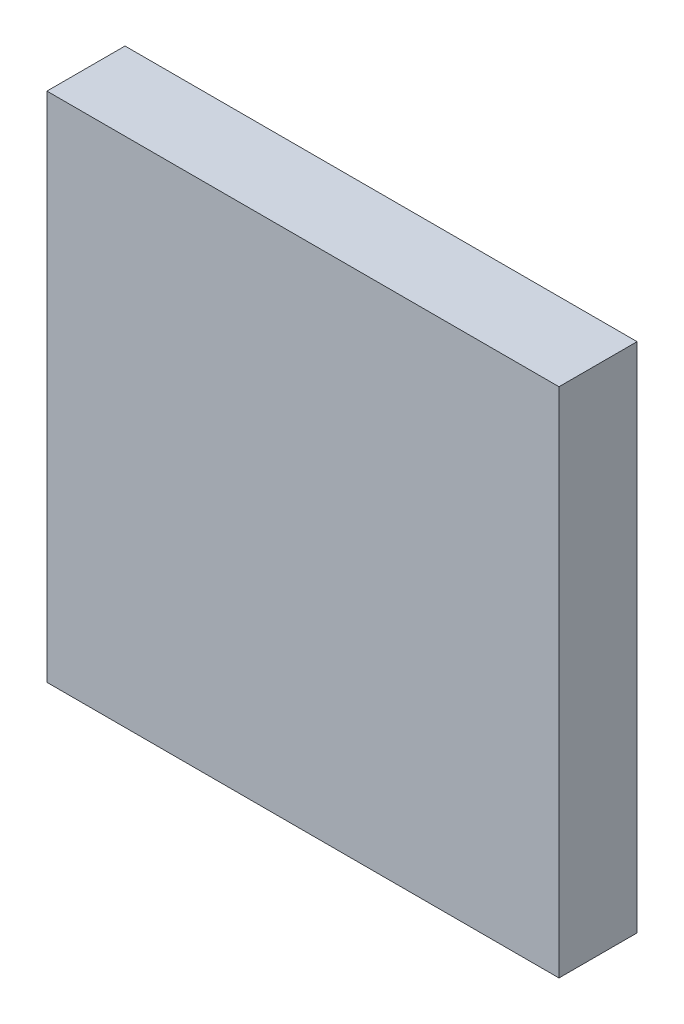
ISO-10303-21;
HEADER;
FILE_DESCRIPTION(('STEP AP214'),'2;1');
FILE_NAME('part.step','',(''),(''),'','','');
FILE_SCHEMA(('AUTOMOTIVE_DESIGN { 1 0 10303 214 1 1 1 1 }'));
ENDSEC;
DATA;
#1=APPLICATION_CONTEXT('core data for automotive mechanical design processes');
#2=APPLICATION_PROTOCOL_DEFINITION('international standard','automotive_design',2000,#1);
#3=PRODUCT_CONTEXT('',#1,'mechanical');
#4=PRODUCT('Part','Part','',(#3));
#5=PRODUCT_RELATED_PRODUCT_CATEGORY('part','',(#4));
#6=PRODUCT_DEFINITION_FORMATION('','',#4);
#7=PRODUCT_DEFINITION_CONTEXT('part definition',#1,'design');
#8=PRODUCT_DEFINITION('design','',#6,#7);
#9=PRODUCT_DEFINITION_SHAPE('','',#8);
#10=(LENGTH_UNIT() NAMED_UNIT(*) SI_UNIT(.MILLI.,.METRE.));
#11=(NAMED_UNIT(*) PLANE_ANGLE_UNIT() SI_UNIT($,.RADIAN.));
#12=(NAMED_UNIT(*) SI_UNIT($,.STERADIAN.) SOLID_ANGLE_UNIT());
#13=UNCERTAINTY_MEASURE_WITH_UNIT(LENGTH_MEASURE(1.E-05),#10,'distance_accuracy_value','');
#14=(GEOMETRIC_REPRESENTATION_CONTEXT(3) GLOBAL_UNCERTAINTY_ASSIGNED_CONTEXT((#13)) GLOBAL_UNIT_ASSIGNED_CONTEXT((#10,
#11,#12)) REPRESENTATION_CONTEXT('',''));
#15=CARTESIAN_POINT('',(0.,0.,0.));
#16=DIRECTION('',(0.,0.,1.));
#17=DIRECTION('',(1.,0.,0.));
#18=AXIS2_PLACEMENT_3D('',#15,#16,#17);
#19=CARTESIAN_POINT('',(150.815,-149.315,0.));
#20=DIRECTION('',(0.,-1.,0.));
#21=DIRECTION('',(1.,0.,0.));
#22=AXIS2_PLACEMENT_3D('',#19,#20,#21);
#23=PLANE('',#22);
#24=DIRECTION('',(0.,0.,1.));
#25=VECTOR('',#24,1.);
#26=CARTESIAN_POINT('',(72.6789610306779,-149.315,0.));
#27=LINE('',#26,#25);
#28=CARTESIAN_POINT('',(72.6789610306779,-149.315,3.5));
#29=VERTEX_POINT('',#28);
#30=CARTESIAN_POINT('',(72.6789610306779,-149.315,44.5));
#31=VERTEX_POINT('',#30);
#32=EDGE_CURVE('E184',#29,#31,#27,.T.);
#33=ORIENTED_EDGE('',*,*,#32,.F.);
#34=DIRECTION('',(-1.,0.,0.));
#35=VECTOR('',#34,1.);
#36=CARTESIAN_POINT('',(150.815,-149.315,3.5));
#37=LINE('',#36,#35);
#38=CARTESIAN_POINT('',(72.6078932188125,-149.315,3.5));
#39=VERTEX_POINT('',#38);
#40=EDGE_CURVE('E258',#29,#39,#37,.T.);
#41=ORIENTED_EDGE('',*,*,#40,.T.);
#42=DIRECTION('',(0.,0.,1.));
#43=VECTOR('',#42,1.);
#44=CARTESIAN_POINT('',(72.6078932188125,-149.315,0.));
#45=LINE('',#44,#43);
#46=CARTESIAN_POINT('',(72.6078932188125,-149.315,0.));
#47=VERTEX_POINT('',#46);
#48=EDGE_CURVE('E323',#47,#39,#45,.T.);
#49=ORIENTED_EDGE('',*,*,#48,.F.);
#50=DIRECTION('',(1.,0.,0.));
#51=VECTOR('',#50,1.);
#52=CARTESIAN_POINT('',(150.815,-149.315,0.));
#53=LINE('',#52,#51);
#54=CARTESIAN_POINT('',(-149.315,-149.315,0.));
#55=VERTEX_POINT('',#54);
#56=EDGE_CURVE('E313',#55,#47,#53,.T.);
#57=ORIENTED_EDGE('',*,*,#56,.F.);
#58=DIRECTION('',(0.,0.,1.));
#59=VECTOR('',#58,1.);
#60=CARTESIAN_POINT('',(-149.315,-149.315,0.));
#61=LINE('',#60,#59);
#62=CARTESIAN_POINT('',(-149.315,-149.315,44.5));
#63=VERTEX_POINT('',#62);
#64=EDGE_CURVE('E303',#55,#63,#61,.T.);
#65=ORIENTED_EDGE('',*,*,#64,.T.);
#66=DIRECTION('',(-1.,0.,0.));
#67=VECTOR('',#66,1.);
#68=CARTESIAN_POINT('',(0.,-149.315,44.5));
#69=LINE('',#68,#67);
#70=EDGE_CURVE('E297',#31,#63,#69,.T.);
#71=ORIENTED_EDGE('',*,*,#70,.F.);
#72=EDGE_LOOP('',(#33,#41,#49,#57,#65,#71));
#73=FACE_BOUND('',#72,.T.);
#74=ADVANCED_FACE('F42',(#73),#23,.F.);
#75=DIRECTION('',(0.,0.,-1.));
#76=VECTOR('',#75,1.);
#77=CARTESIAN_POINT('',(76.0378952120001,-149.315,53.4153545558223));
#78=LINE('',#77,#76);
#79=CARTESIAN_POINT('',(76.0378952120001,-149.315,44.5));
#80=VERTEX_POINT('',#79);
#81=CARTESIAN_POINT('',(76.0378952120001,-149.315,3.5));
#82=VERTEX_POINT('',#81);
#83=EDGE_CURVE('E57',#80,#82,#78,.T.);
#84=ORIENTED_EDGE('',*,*,#83,.F.);
#85=CARTESIAN_POINT('',(149.315,-149.315,44.5));
#86=VERTEX_POINT('',#85);
#87=EDGE_CURVE('E301',#86,#80,#69,.T.);
#88=ORIENTED_EDGE('',*,*,#87,.F.);
#89=DIRECTION('',(0.,0.,1.));
#90=VECTOR('',#89,1.);
#91=CARTESIAN_POINT('',(149.315,-149.315,0.));
#92=LINE('',#91,#90);
#93=CARTESIAN_POINT('',(149.315,-149.315,0.));
#94=VERTEX_POINT('',#93);
#95=EDGE_CURVE('E286',#94,#86,#92,.T.);
#96=ORIENTED_EDGE('',*,*,#95,.F.);
#97=CARTESIAN_POINT('',(142.017106781187,-149.315,0.));
#98=VERTEX_POINT('',#97);
#99=EDGE_CURVE('E306',#98,#94,#53,.T.);
#100=ORIENTED_EDGE('',*,*,#99,.F.);
#101=DIRECTION('',(0.,0.,-1.));
#102=VECTOR('',#101,1.);
#103=CARTESIAN_POINT('',(142.017106781187,-149.315,0.));
#104=LINE('',#103,#102);
#105=CARTESIAN_POINT('',(142.017106781187,-149.315,3.5));
#106=VERTEX_POINT('',#105);
#107=EDGE_CURVE('E321',#106,#98,#104,.T.);
#108=ORIENTED_EDGE('',*,*,#107,.F.);
#109=EDGE_CURVE('E318',#106,#82,#37,.T.);
#110=ORIENTED_EDGE('',*,*,#109,.T.);
#111=EDGE_LOOP('',(#84,#88,#96,#100,#108,#110));
#112=FACE_BOUND('',#111,.T.);
#113=ADVANCED_FACE('F356',(#112),#23,.F.);
#114=CARTESIAN_POINT('',(-150.815,-150.815,0.));
#115=DIRECTION('',(0.,0.,-1.));
#116=DIRECTION('',(0.,-1.,0.));
#117=AXIS2_PLACEMENT_3D('',#114,#115,#116);
#118=PLANE('',#117);
#119=DIRECTION('',(0.,-1.,0.));
#120=VECTOR('',#119,1.);
#121=CARTESIAN_POINT('',(-150.815,-150.815,0.));
#122=LINE('',#121,#120);
#123=CARTESIAN_POINT('',(-150.815,150.815,0.));
#124=VERTEX_POINT('',#123);
#125=CARTESIAN_POINT('',(-150.815,-150.815,0.));
#126=VERTEX_POINT('',#125);
#127=EDGE_CURVE('E269',#124,#126,#122,.T.);
#128=ORIENTED_EDGE('',*,*,#127,.F.);
#129=DIRECTION('',(-1.,0.,0.));
#130=VECTOR('',#129,1.);
#131=CARTESIAN_POINT('',(150.815,150.815,0.));
#132=LINE('',#131,#130);
#133=CARTESIAN_POINT('',(150.815,150.815,0.));
#134=VERTEX_POINT('',#133);
#135=EDGE_CURVE('E259',#134,#124,#132,.T.);
#136=ORIENTED_EDGE('',*,*,#135,.F.);
#137=DIRECTION('',(0.,1.,0.));
#138=VECTOR('',#137,1.);
#139=CARTESIAN_POINT('',(150.815,-150.815,0.));
#140=LINE('',#139,#138);
#141=CARTESIAN_POINT('',(150.815,-150.815,0.));
#142=VERTEX_POINT('',#141);
#143=EDGE_CURVE('E263',#142,#134,#140,.T.);
#144=ORIENTED_EDGE('',*,*,#143,.F.);
#145=DIRECTION('',(1.,0.,0.));
#146=VECTOR('',#145,1.);
#147=CARTESIAN_POINT('',(150.815,-150.815,0.));
#148=LINE('',#147,#146);
#149=EDGE_CURVE('E267',#126,#142,#148,.T.);
#150=ORIENTED_EDGE('',*,*,#149,.F.);
#151=EDGE_LOOP('',(#128,#136,#144,#150));
#152=FACE_BOUND('',#151,.T.);
#153=ORIENTED_EDGE('',*,*,#56,.T.);
#154=DIRECTION('',(0.707106781186542,-0.707106781186553,0.));
#155=VECTOR('',#154,1.);
#156=CARTESIAN_POINT('',(70.4589466094064,-147.166053390594,0.));
#157=LINE('',#156,#155);
#158=CARTESIAN_POINT('',(74.1053932188129,-150.8125,0.));
#159=VERTEX_POINT('',#158);
#160=EDGE_CURVE('E206',#47,#159,#157,.T.);
#161=ORIENTED_EDGE('',*,*,#160,.T.);
#162=DIRECTION('',(1.,0.,0.));
#163=VECTOR('',#162,1.);
#164=CARTESIAN_POINT('',(74.1053932188129,-150.8125,0.));
#165=LINE('',#164,#163);
#166=CARTESIAN_POINT('',(140.519606781187,-150.8125,0.));
#167=VERTEX_POINT('',#166);
#168=EDGE_CURVE('E223',#159,#167,#165,.T.);
#169=ORIENTED_EDGE('',*,*,#168,.T.);
#170=DIRECTION('',(0.707106781186547,0.707106781186548,0.));
#171=VECTOR('',#170,1.);
#172=CARTESIAN_POINT('',(140.519606781187,-150.8125,0.));
#173=LINE('',#172,#171);
#174=EDGE_CURVE('E227',#167,#98,#173,.T.);
#175=ORIENTED_EDGE('',*,*,#174,.T.);
#176=ORIENTED_EDGE('',*,*,#99,.T.);
#177=DIRECTION('',(0.,1.,0.));
#178=VECTOR('',#177,1.);
#179=CARTESIAN_POINT('',(149.315,-150.815,0.));
#180=LINE('',#179,#178);
#181=CARTESIAN_POINT('',(149.315,-142.017106781187,0.));
#182=VERTEX_POINT('',#181);
#183=EDGE_CURVE('E307',#94,#182,#180,.T.);
#184=ORIENTED_EDGE('',*,*,#183,.T.);
#185=CARTESIAN_POINT('',(150.8125,-140.519606781187,0.));
#186=VERTEX_POINT('',#185);
#187=EDGE_CURVE('E226',#182,#186,#173,.T.);
#188=ORIENTED_EDGE('',*,*,#187,.T.);
#189=DIRECTION('',(0.,1.,0.));
#190=VECTOR('',#189,1.);
#191=CARTESIAN_POINT('',(150.8125,-140.519606781187,0.));
#192=LINE('',#191,#190);
#193=CARTESIAN_POINT('',(150.8125,-74.1053932188143,0.));
#194=VERTEX_POINT('',#193);
#195=EDGE_CURVE('E230',#186,#194,#192,.T.);
#196=ORIENTED_EDGE('',*,*,#195,.T.);
#197=DIRECTION('',(-0.707106781186554,0.707106781186541,0.));
#198=VECTOR('',#197,1.);
#199=CARTESIAN_POINT('',(150.8125,-74.1053932188143,0.));
#200=LINE('',#199,#198);
#201=CARTESIAN_POINT('',(149.315,-72.6078932188143,0.));
#202=VERTEX_POINT('',#201);
#203=EDGE_CURVE('E210',#194,#202,#200,.T.);
#204=ORIENTED_EDGE('',*,*,#203,.T.);
#205=CARTESIAN_POINT('',(149.315,149.315,0.));
#206=VERTEX_POINT('',#205);
#207=EDGE_CURVE('E300',#202,#206,#180,.T.);
#208=ORIENTED_EDGE('',*,*,#207,.T.);
#209=DIRECTION('',(-1.,0.,0.));
#210=VECTOR('',#209,1.);
#211=CARTESIAN_POINT('',(150.815,149.315,0.));
#212=LINE('',#211,#210);
#213=CARTESIAN_POINT('',(-149.315,149.315,0.));
#214=VERTEX_POINT('',#213);
#215=EDGE_CURVE('E287',#206,#214,#212,.T.);
#216=ORIENTED_EDGE('',*,*,#215,.T.);
#217=DIRECTION('',(0.,1.,0.));
#218=VECTOR('',#217,1.);
#219=CARTESIAN_POINT('',(-149.315,-150.815,0.));
#220=LINE('',#219,#218);
#221=EDGE_CURVE('E292',#214,#55,#220,.F.);
#222=ORIENTED_EDGE('',*,*,#221,.T.);
#223=EDGE_LOOP('',(#153,#161,#169,#175,#176,#184,#188,#196,#204,#208,#216,#222));
#224=FACE_BOUND('',#223,.T.);
#225=ADVANCED_FACE('F44',(#152,#224),#118,.T.);
#226=CARTESIAN_POINT('',(149.315,-150.815,0.));
#227=DIRECTION('',(1.,0.,0.));
#228=DIRECTION('',(0.,0.,-1.));
#229=AXIS2_PLACEMENT_3D('',#226,#227,#228);
#230=PLANE('',#229);
#231=DIRECTION('',(0.,0.,1.));
#232=VECTOR('',#231,1.);
#233=CARTESIAN_POINT('',(149.315,-142.017106781187,0.));
#234=LINE('',#233,#232);
#235=CARTESIAN_POINT('',(149.315,-142.017106781187,3.5));
#236=VERTEX_POINT('',#235);
#237=EDGE_CURVE('E245',#182,#236,#234,.T.);
#238=ORIENTED_EDGE('',*,*,#237,.F.);
#239=ORIENTED_EDGE('',*,*,#183,.F.);
#240=ORIENTED_EDGE('',*,*,#95,.T.);
#241=DIRECTION('',(0.,-1.,0.));
#242=VECTOR('',#241,1.);
#243=CARTESIAN_POINT('',(149.315,0.,44.5));
#244=LINE('',#243,#242);
#245=CARTESIAN_POINT('',(149.315,149.315,44.5));
#246=VERTEX_POINT('',#245);
#247=EDGE_CURVE('E291',#246,#86,#244,.T.);
#248=ORIENTED_EDGE('',*,*,#247,.F.);
#249=DIRECTION('',(0.,0.,1.));
#250=VECTOR('',#249,1.);
#251=CARTESIAN_POINT('',(149.315,149.315,0.));
#252=LINE('',#251,#250);
#253=EDGE_CURVE('E247',#206,#246,#252,.T.);
#254=ORIENTED_EDGE('',*,*,#253,.F.);
#255=ORIENTED_EDGE('',*,*,#207,.F.);
#256=DIRECTION('',(0.,0.,-1.));
#257=VECTOR('',#256,1.);
#258=CARTESIAN_POINT('',(149.315,-72.6078932188143,0.));
#259=LINE('',#258,#257);
#260=CARTESIAN_POINT('',(149.315,-72.6078932188143,3.5));
#261=VERTEX_POINT('',#260);
#262=EDGE_CURVE('E326',#261,#202,#259,.T.);
#263=ORIENTED_EDGE('',*,*,#262,.F.);
#264=DIRECTION('',(0.,-1.,0.));
#265=VECTOR('',#264,1.);
#266=CARTESIAN_POINT('',(149.315,-150.815,3.5));
#267=LINE('',#266,#265);
#268=EDGE_CURVE('E242',#261,#236,#267,.T.);
#269=ORIENTED_EDGE('',*,*,#268,.T.);
#270=EDGE_LOOP('',(#238,#239,#240,#248,#254,#255,#263,#269));
#271=FACE_BOUND('',#270,.T.);
#272=ADVANCED_FACE('F352',(#271),#230,.F.);
#273=CARTESIAN_POINT('',(150.815,150.815,0.));
#274=DIRECTION('',(0.,1.,0.));
#275=DIRECTION('',(-1.,0.,0.));
#276=AXIS2_PLACEMENT_3D('',#273,#274,#275);
#277=PLANE('',#276);
#278=DIRECTION('',(0.,0.,1.));
#279=VECTOR('',#278,1.);
#280=CARTESIAN_POINT('',(-150.815,150.815,0.));
#281=LINE('',#280,#279);
#282=CARTESIAN_POINT('',(-150.815,150.815,46.));
#283=VERTEX_POINT('',#282);
#284=EDGE_CURVE('E261',#124,#283,#281,.T.);
#285=ORIENTED_EDGE('',*,*,#284,.T.);
#286=DIRECTION('',(1.,0.,0.));
#287=VECTOR('',#286,1.);
#288=CARTESIAN_POINT('',(150.815,150.815,46.));
#289=LINE('',#288,#287);
#290=CARTESIAN_POINT('',(150.815,150.815,46.));
#291=VERTEX_POINT('',#290);
#292=EDGE_CURVE('E252',#283,#291,#289,.T.);
#293=ORIENTED_EDGE('',*,*,#292,.T.);
#294=DIRECTION('',(0.,0.,1.));
#295=VECTOR('',#294,1.);
#296=CARTESIAN_POINT('',(150.815,150.815,0.));
#297=LINE('',#296,#295);
#298=EDGE_CURVE('E262',#134,#291,#297,.T.);
#299=ORIENTED_EDGE('',*,*,#298,.F.);
#300=ORIENTED_EDGE('',*,*,#135,.T.);
#301=EDGE_LOOP('',(#285,#293,#299,#300));
#302=FACE_BOUND('',#301,.T.);
#303=ADVANCED_FACE('F477',(#302),#277,.T.);
#304=CARTESIAN_POINT('',(150.815,-150.815,0.));
#305=DIRECTION('',(1.,0.,0.));
#306=DIRECTION('',(0.,0.,-1.));
#307=AXIS2_PLACEMENT_3D('',#304,#305,#306);
#308=PLANE('',#307);
#309=ORIENTED_EDGE('',*,*,#298,.T.);
#310=DIRECTION('',(0.,-1.,0.));
#311=VECTOR('',#310,1.);
#312=CARTESIAN_POINT('',(150.815,-150.815,46.));
#313=LINE('',#312,#311);
#314=CARTESIAN_POINT('',(150.815,-150.815,46.));
#315=VERTEX_POINT('',#314);
#316=EDGE_CURVE('E248',#291,#315,#313,.T.);
#317=ORIENTED_EDGE('',*,*,#316,.T.);
#318=DIRECTION('',(0.,0.,1.));
#319=VECTOR('',#318,1.);
#320=CARTESIAN_POINT('',(150.815,-150.815,0.));
#321=LINE('',#320,#319);
#322=EDGE_CURVE('E266',#142,#315,#321,.T.);
#323=ORIENTED_EDGE('',*,*,#322,.F.);
#324=ORIENTED_EDGE('',*,*,#143,.T.);
#325=EDGE_LOOP('',(#309,#317,#323,#324));
#326=FACE_BOUND('',#325,.T.);
#327=ADVANCED_FACE('F483',(#326),#308,.T.);
#328=CARTESIAN_POINT('',(150.815,-150.815,0.));
#329=DIRECTION('',(0.,-1.,0.));
#330=DIRECTION('',(1.,0.,0.));
#331=AXIS2_PLACEMENT_3D('',#328,#329,#330);
#332=PLANE('',#331);
#333=ORIENTED_EDGE('',*,*,#322,.T.);
#334=DIRECTION('',(-1.,0.,0.));
#335=VECTOR('',#334,1.);
#336=CARTESIAN_POINT('',(150.815,-150.815,46.));
#337=LINE('',#336,#335);
#338=CARTESIAN_POINT('',(-150.815,-150.815,46.));
#339=VERTEX_POINT('',#338);
#340=EDGE_CURVE('E251',#315,#339,#337,.T.);
#341=ORIENTED_EDGE('',*,*,#340,.T.);
#342=DIRECTION('',(0.,0.,1.));
#343=VECTOR('',#342,1.);
#344=CARTESIAN_POINT('',(-150.815,-150.815,0.));
#345=LINE('',#344,#343);
#346=EDGE_CURVE('E265',#126,#339,#345,.T.);
#347=ORIENTED_EDGE('',*,*,#346,.F.);
#348=ORIENTED_EDGE('',*,*,#149,.T.);
#349=EDGE_LOOP('',(#333,#341,#347,#348));
#350=FACE_BOUND('',#349,.T.);
#351=ADVANCED_FACE('F492',(#350),#332,.T.);
#352=CARTESIAN_POINT('',(-150.815,-150.815,0.));
#353=DIRECTION('',(-1.,0.,0.));
#354=DIRECTION('',(0.,0.,1.));
#355=AXIS2_PLACEMENT_3D('',#352,#353,#354);
#356=PLANE('',#355);
#357=ORIENTED_EDGE('',*,*,#346,.T.);
#358=DIRECTION('',(0.,1.,0.));
#359=VECTOR('',#358,1.);
#360=CARTESIAN_POINT('',(-150.815,-150.815,46.));
#361=LINE('',#360,#359);
#362=EDGE_CURVE('E255',#339,#283,#361,.T.);
#363=ORIENTED_EDGE('',*,*,#362,.T.);
#364=ORIENTED_EDGE('',*,*,#284,.F.);
#365=ORIENTED_EDGE('',*,*,#127,.T.);
#366=EDGE_LOOP('',(#357,#363,#364,#365));
#367=FACE_BOUND('',#366,.T.);
#368=ADVANCED_FACE('F501',(#367),#356,.T.);
#369=CARTESIAN_POINT('',(0.,0.,46.));
#370=DIRECTION('',(0.,0.,-1.));
#371=DIRECTION('',(-1.,0.,0.));
#372=AXIS2_PLACEMENT_3D('',#369,#370,#371);
#373=PLANE('',#372);
#374=ORIENTED_EDGE('',*,*,#362,.F.);
#375=ORIENTED_EDGE('',*,*,#340,.F.);
#376=ORIENTED_EDGE('',*,*,#316,.F.);
#377=ORIENTED_EDGE('',*,*,#292,.F.);
#378=EDGE_LOOP('',(#374,#375,#376,#377));
#379=FACE_BOUND('',#378,.T.);
#380=ADVANCED_FACE('F510',(#379),#373,.F.);
#381=CARTESIAN_POINT('',(150.815,149.315,0.));
#382=DIRECTION('',(0.,1.,0.));
#383=DIRECTION('',(-1.,0.,0.));
#384=AXIS2_PLACEMENT_3D('',#381,#382,#383);
#385=PLANE('',#384);
#386=DIRECTION('',(0.,0.,1.));
#387=VECTOR('',#386,1.);
#388=CARTESIAN_POINT('',(-149.315,149.315,0.));
#389=LINE('',#388,#387);
#390=CARTESIAN_POINT('',(-149.315,149.315,44.5));
#391=VERTEX_POINT('',#390);
#392=EDGE_CURVE('E283',#214,#391,#389,.T.);
#393=ORIENTED_EDGE('',*,*,#392,.F.);
#394=ORIENTED_EDGE('',*,*,#215,.F.);
#395=ORIENTED_EDGE('',*,*,#253,.T.);
#396=DIRECTION('',(1.,0.,0.));
#397=VECTOR('',#396,1.);
#398=CARTESIAN_POINT('',(0.,149.315,44.5));
#399=LINE('',#398,#397);
#400=EDGE_CURVE('E288',#391,#246,#399,.T.);
#401=ORIENTED_EDGE('',*,*,#400,.F.);
#402=EDGE_LOOP('',(#393,#394,#395,#401));
#403=FACE_BOUND('',#402,.T.);
#404=ADVANCED_FACE('F344',(#403),#385,.F.);
#405=CARTESIAN_POINT('',(-149.315,-150.815,0.));
#406=DIRECTION('',(-1.,0.,0.));
#407=DIRECTION('',(0.,0.,1.));
#408=AXIS2_PLACEMENT_3D('',#405,#406,#407);
#409=PLANE('',#408);
#410=ORIENTED_EDGE('',*,*,#64,.F.);
#411=ORIENTED_EDGE('',*,*,#221,.F.);
#412=ORIENTED_EDGE('',*,*,#392,.T.);
#413=DIRECTION('',(0.,1.,0.));
#414=VECTOR('',#413,1.);
#415=CARTESIAN_POINT('',(-149.315,0.,44.5));
#416=LINE('',#415,#414);
#417=EDGE_CURVE('E280',#63,#391,#416,.T.);
#418=ORIENTED_EDGE('',*,*,#417,.F.);
#419=EDGE_LOOP('',(#410,#411,#412,#418));
#420=FACE_BOUND('',#419,.T.);
#421=ADVANCED_FACE('F340',(#420),#409,.F.);
#422=CARTESIAN_POINT('',(0.,0.,44.5));
#423=DIRECTION('',(0.,0.,-1.));
#424=DIRECTION('',(-1.,0.,0.));
#425=AXIS2_PLACEMENT_3D('',#422,#423,#424);
#426=PLANE('',#425);
#427=ORIENTED_EDGE('',*,*,#87,.T.);
#428=CARTESIAN_POINT('',(73.221560742502,-147.236957614504,44.5));
#429=DIRECTION('',(0.,0.,-1.));
#430=DIRECTION('',(-1.,0.,0.));
#431=AXIS2_PLACEMENT_3D('',#428,#429,#430);
#432=CIRCLE('',#431,3.49999999999988);
#433=CARTESIAN_POINT('',(75.6557685091343,-149.751839828221,44.5));
#434=VERTEX_POINT('',#433);
#435=EDGE_CURVE('E188',#80,#434,#432,.T.);
#436=ORIENTED_EDGE('',*,*,#435,.T.);
#437=DIRECTION('',(-1.,0.,0.));
#438=VECTOR('',#437,1.);
#439=CARTESIAN_POINT('',(73.1158008588987,-149.751839828221,44.5));
#440=LINE('',#439,#438);
#441=CARTESIAN_POINT('',(73.1158008588987,-149.751839828221,44.5));
#442=VERTEX_POINT('',#441);
#443=EDGE_CURVE('E189',#434,#442,#440,.T.);
#444=ORIENTED_EDGE('',*,*,#443,.T.);
#445=DIRECTION('',(-0.707106781186549,0.707106781186546,0.));
#446=VECTOR('',#445,1.);
#447=CARTESIAN_POINT('',(73.1158008588987,-149.751839828221,44.5));
#448=LINE('',#447,#446);
#449=EDGE_CURVE('E178',#442,#31,#448,.T.);
#450=ORIENTED_EDGE('',*,*,#449,.T.);
#451=ORIENTED_EDGE('',*,*,#70,.T.);
#452=ORIENTED_EDGE('',*,*,#417,.T.);
#453=ORIENTED_EDGE('',*,*,#400,.T.);
#454=ORIENTED_EDGE('',*,*,#247,.T.);
#455=EDGE_LOOP('',(#427,#436,#444,#450,#451,#452,#453,#454));
#456=FACE_BOUND('',#455,.T.);
#457=ADVANCED_FACE('F200',(#456),#426,.T.);
#458=CARTESIAN_POINT('',(0.,0.,3.5));
#459=DIRECTION('',(0.,0.,1.));
#460=DIRECTION('',(1.,0.,0.));
#461=AXIS2_PLACEMENT_3D('',#458,#459,#460);
#462=PLANE('',#461);
#463=DIRECTION('',(-0.707106781186549,0.707106781186546,0.));
#464=VECTOR('',#463,1.);
#465=CARTESIAN_POINT('',(-38.3180194846612,-38.3180194846614,3.5));
#466=LINE('',#465,#464);
#467=CARTESIAN_POINT('',(73.1158008588987,-149.751839828221,3.5));
#468=VERTEX_POINT('',#467);
#469=EDGE_CURVE('E12',#468,#29,#466,.T.);
#470=ORIENTED_EDGE('',*,*,#469,.F.);
#471=DIRECTION('',(-1.,0.,0.));
#472=VECTOR('',#471,1.);
#473=CARTESIAN_POINT('',(4.90925368306908E-12,-149.751839828223,3.5));
#474=LINE('',#473,#472);
#475=CARTESIAN_POINT('',(75.6557685091343,-149.751839828221,3.5));
#476=VERTEX_POINT('',#475);
#477=EDGE_CURVE('E50',#476,#468,#474,.T.);
#478=ORIENTED_EDGE('',*,*,#477,.F.);
#479=CARTESIAN_POINT('',(73.221560742502,-147.236957614504,3.5));
#480=DIRECTION('',(0.,0.,1.));
#481=DIRECTION('',(1.,0.,0.));
#482=AXIS2_PLACEMENT_3D('',#479,#480,#481);
#483=CIRCLE('',#482,3.49999999999988);
#484=EDGE_CURVE('E328',#82,#476,#483,.F.);
#485=ORIENTED_EDGE('',*,*,#484,.F.);
#486=ORIENTED_EDGE('',*,*,#109,.F.);
#487=DIRECTION('',(0.707106781186547,0.707106781186548,0.));
#488=VECTOR('',#487,1.);
#489=CARTESIAN_POINT('',(140.519606781187,-150.8125,3.5));
#490=LINE('',#489,#488);
#491=CARTESIAN_POINT('',(140.519606781187,-150.8125,3.5));
#492=VERTEX_POINT('',#491);
#493=EDGE_CURVE('E212',#492,#106,#490,.T.);
#494=ORIENTED_EDGE('',*,*,#493,.F.);
#495=DIRECTION('',(1.,0.,0.));
#496=VECTOR('',#495,1.);
#497=CARTESIAN_POINT('',(74.1053932188129,-150.8125,3.5));
#498=LINE('',#497,#496);
#499=CARTESIAN_POINT('',(74.1053932188129,-150.8125,3.5));
#500=VERTEX_POINT('',#499);
#501=EDGE_CURVE('E209',#500,#492,#498,.T.);
#502=ORIENTED_EDGE('',*,*,#501,.F.);
#503=DIRECTION('',(0.707106781186542,-0.707106781186553,0.));
#504=VECTOR('',#503,1.);
#505=CARTESIAN_POINT('',(70.4589466094064,-147.166053390594,3.5));
#506=LINE('',#505,#504);
#507=EDGE_CURVE('E207',#39,#500,#506,.T.);
#508=ORIENTED_EDGE('',*,*,#507,.F.);
#509=ORIENTED_EDGE('',*,*,#40,.F.);
#510=EDGE_LOOP('',(#470,#478,#485,#486,#494,#502,#508,#509));
#511=FACE_BOUND('',#510,.T.);
#512=ADVANCED_FACE('F331',(#511),#462,.F.);
#513=CARTESIAN_POINT('',(140.519606781187,-150.8125,3.5));
#514=DIRECTION('',(-0.707106781186548,0.707106781186547,0.));
#515=DIRECTION('',(-0.707106781186547,-0.707106781186548,0.));
#516=AXIS2_PLACEMENT_3D('',#513,#514,#515);
#517=PLANE('',#516);
#518=ORIENTED_EDGE('',*,*,#107,.T.);
#519=ORIENTED_EDGE('',*,*,#174,.F.);
#520=DIRECTION('',(0.,0.,-1.));
#521=VECTOR('',#520,1.);
#522=CARTESIAN_POINT('',(140.519606781187,-150.8125,3.5));
#523=LINE('',#522,#521);
#524=EDGE_CURVE('E238',#492,#167,#523,.T.);
#525=ORIENTED_EDGE('',*,*,#524,.F.);
#526=ORIENTED_EDGE('',*,*,#493,.T.);
#527=EDGE_LOOP('',(#518,#519,#525,#526));
#528=FACE_BOUND('',#527,.T.);
#529=ADVANCED_FACE('F363',(#528),#517,.T.);
#530=CARTESIAN_POINT('',(70.4589466094064,-147.166053390594,3.5));
#531=DIRECTION('',(0.707106781186553,0.707106781186542,0.));
#532=DIRECTION('',(-0.707106781186542,0.707106781186553,0.));
#533=AXIS2_PLACEMENT_3D('',#530,#531,#532);
#534=PLANE('',#533);
#535=ORIENTED_EDGE('',*,*,#48,.T.);
#536=ORIENTED_EDGE('',*,*,#507,.T.);
#537=DIRECTION('',(0.,0.,-1.));
#538=VECTOR('',#537,1.);
#539=CARTESIAN_POINT('',(74.1053932188129,-150.8125,3.5));
#540=LINE('',#539,#538);
#541=EDGE_CURVE('E240',#500,#159,#540,.T.);
#542=ORIENTED_EDGE('',*,*,#541,.T.);
#543=ORIENTED_EDGE('',*,*,#160,.F.);
#544=EDGE_LOOP('',(#535,#536,#542,#543));
#545=FACE_BOUND('',#544,.T.);
#546=ADVANCED_FACE('F370',(#545),#534,.T.);
#547=CARTESIAN_POINT('',(74.1053932188129,-150.8125,3.5));
#548=DIRECTION('',(0.,1.,0.));
#549=DIRECTION('',(0.,0.,1.));
#550=AXIS2_PLACEMENT_3D('',#547,#548,#549);
#551=PLANE('',#550);
#552=ORIENTED_EDGE('',*,*,#168,.F.);
#553=ORIENTED_EDGE('',*,*,#541,.F.);
#554=ORIENTED_EDGE('',*,*,#501,.T.);
#555=ORIENTED_EDGE('',*,*,#524,.T.);
#556=EDGE_LOOP('',(#552,#553,#554,#555));
#557=FACE_BOUND('',#556,.T.);
#558=ADVANCED_FACE('F367',(#557),#551,.T.);
#559=CARTESIAN_POINT('',(150.8125,-74.1053932188143,3.5));
#560=DIRECTION('',(-0.707106781186541,-0.707106781186554,0.));
#561=DIRECTION('',(0.707106781186554,-0.707106781186541,0.));
#562=AXIS2_PLACEMENT_3D('',#559,#560,#561);
#563=PLANE('',#562);
#564=ORIENTED_EDGE('',*,*,#262,.T.);
#565=ORIENTED_EDGE('',*,*,#203,.F.);
#566=DIRECTION('',(0.,0.,-1.));
#567=VECTOR('',#566,1.);
#568=CARTESIAN_POINT('',(150.8125,-74.1053932188143,3.5));
#569=LINE('',#568,#567);
#570=CARTESIAN_POINT('',(150.8125,-74.1053932188143,3.5));
#571=VERTEX_POINT('',#570);
#572=EDGE_CURVE('E220',#571,#194,#569,.T.);
#573=ORIENTED_EDGE('',*,*,#572,.F.);
#574=DIRECTION('',(-0.707106781186554,0.707106781186541,0.));
#575=VECTOR('',#574,1.);
#576=CARTESIAN_POINT('',(150.8125,-74.1053932188143,3.5));
#577=LINE('',#576,#575);
#578=EDGE_CURVE('E217',#571,#261,#577,.T.);
#579=ORIENTED_EDGE('',*,*,#578,.T.);
#580=EDGE_LOOP('',(#564,#565,#573,#579));
#581=FACE_BOUND('',#580,.T.);
#582=ADVANCED_FACE('F381',(#581),#563,.T.);
#583=ORIENTED_EDGE('',*,*,#237,.T.);
#584=CARTESIAN_POINT('',(150.8125,-140.519606781187,3.5));
#585=VERTEX_POINT('',#584);
#586=EDGE_CURVE('E65',#236,#585,#490,.T.);
#587=ORIENTED_EDGE('',*,*,#586,.T.);
#588=DIRECTION('',(0.,0.,-1.));
#589=VECTOR('',#588,1.);
#590=CARTESIAN_POINT('',(150.8125,-140.519606781187,3.5));
#591=LINE('',#590,#589);
#592=EDGE_CURVE('E236',#585,#186,#591,.T.);
#593=ORIENTED_EDGE('',*,*,#592,.T.);
#594=ORIENTED_EDGE('',*,*,#187,.F.);
#595=EDGE_LOOP('',(#583,#587,#593,#594));
#596=FACE_BOUND('',#595,.T.);
#597=ADVANCED_FACE('F373',(#596),#517,.T.);
#598=ORIENTED_EDGE('',*,*,#578,.F.);
#599=DIRECTION('',(0.,1.,0.));
#600=VECTOR('',#599,1.);
#601=CARTESIAN_POINT('',(150.8125,-140.519606781187,3.5));
#602=LINE('',#601,#600);
#603=EDGE_CURVE('E215',#585,#571,#602,.T.);
#604=ORIENTED_EDGE('',*,*,#603,.F.);
#605=ORIENTED_EDGE('',*,*,#586,.F.);
#606=ORIENTED_EDGE('',*,*,#268,.F.);
#607=EDGE_LOOP('',(#598,#604,#605,#606));
#608=FACE_BOUND('',#607,.T.);
#609=ADVANCED_FACE('F382',(#608),#462,.F.);
#610=CARTESIAN_POINT('',(150.8125,-140.519606781187,3.5));
#611=DIRECTION('',(-1.,0.,0.));
#612=DIRECTION('',(0.,0.,1.));
#613=AXIS2_PLACEMENT_3D('',#610,#611,#612);
#614=PLANE('',#613);
#615=ORIENTED_EDGE('',*,*,#195,.F.);
#616=ORIENTED_EDGE('',*,*,#592,.F.);
#617=ORIENTED_EDGE('',*,*,#603,.T.);
#618=ORIENTED_EDGE('',*,*,#572,.T.);
#619=EDGE_LOOP('',(#615,#616,#617,#618));
#620=FACE_BOUND('',#619,.T.);
#621=ADVANCED_FACE('F377',(#620),#614,.T.);
#622=CARTESIAN_POINT('',(73.1158008588987,-149.751839828221,53.4153545558223));
#623=DIRECTION('',(0.,1.,0.));
#624=DIRECTION('',(-1.,0.,0.));
#625=AXIS2_PLACEMENT_3D('',#622,#623,#624);
#626=PLANE('',#625);
#627=ORIENTED_EDGE('',*,*,#477,.T.);
#628=DIRECTION('',(0.,0.,-1.));
#629=VECTOR('',#628,1.);
#630=CARTESIAN_POINT('',(73.1158008588987,-149.751839828221,53.4153545558223));
#631=LINE('',#630,#629);
#632=EDGE_CURVE('E181',#442,#468,#631,.T.);
#633=ORIENTED_EDGE('',*,*,#632,.F.);
#634=ORIENTED_EDGE('',*,*,#443,.F.);
#635=DIRECTION('',(0.,0.,-1.));
#636=VECTOR('',#635,1.);
#637=CARTESIAN_POINT('',(75.6557685091343,-149.751839828221,53.4153545558223));
#638=LINE('',#637,#636);
#639=EDGE_CURVE('E197',#434,#476,#638,.T.);
#640=ORIENTED_EDGE('',*,*,#639,.T.);
#641=EDGE_LOOP('',(#627,#633,#634,#640));
#642=FACE_BOUND('',#641,.T.);
#643=ADVANCED_FACE('F193',(#642),#626,.T.);
#644=CARTESIAN_POINT('',(73.1158008588987,-149.751839828221,53.4153545558223));
#645=DIRECTION('',(0.707106781186546,0.707106781186549,0.));
#646=DIRECTION('',(-0.707106781186549,0.707106781186546,0.));
#647=AXIS2_PLACEMENT_3D('',#644,#645,#646);
#648=PLANE('',#647);
#649=ORIENTED_EDGE('',*,*,#32,.T.);
#650=ORIENTED_EDGE('',*,*,#449,.F.);
#651=ORIENTED_EDGE('',*,*,#632,.T.);
#652=ORIENTED_EDGE('',*,*,#469,.T.);
#653=EDGE_LOOP('',(#649,#650,#651,#652));
#654=FACE_BOUND('',#653,.T.);
#655=ADVANCED_FACE('F180',(#654),#648,.T.);
#656=CARTESIAN_POINT('',(73.221560742502,-147.236957614504,53.4153545558223));
#657=DIRECTION('',(0.,0.,-1.));
#658=DIRECTION('',(-1.,0.,0.));
#659=AXIS2_PLACEMENT_3D('',#656,#657,#658);
#660=CYLINDRICAL_SURFACE('',#659,3.49999999999988);
#661=ORIENTED_EDGE('',*,*,#83,.T.);
#662=ORIENTED_EDGE('',*,*,#484,.T.);
#663=ORIENTED_EDGE('',*,*,#639,.F.);
#664=ORIENTED_EDGE('',*,*,#435,.F.);
#665=EDGE_LOOP('',(#661,#662,#663,#664));
#666=FACE_BOUND('',#665,.T.);
#667=ADVANCED_FACE('F329',(#666),#660,.F.);
#668=CLOSED_SHELL('',(#74,#113,#225,#272,#303,#327,#351,#368,#380,#404,#421,#457,#512,#529,#546,
#558,#582,#597,#609,#621,#643,#655,#667));
#669=MANIFOLD_SOLID_BREP('B2',#668);
#670=ADVANCED_BREP_SHAPE_REPRESENTATION('',(#18,#669),#14);
#671=SHAPE_DEFINITION_REPRESENTATION(#9,#670);
ENDSEC;
END-ISO-10303-21;
